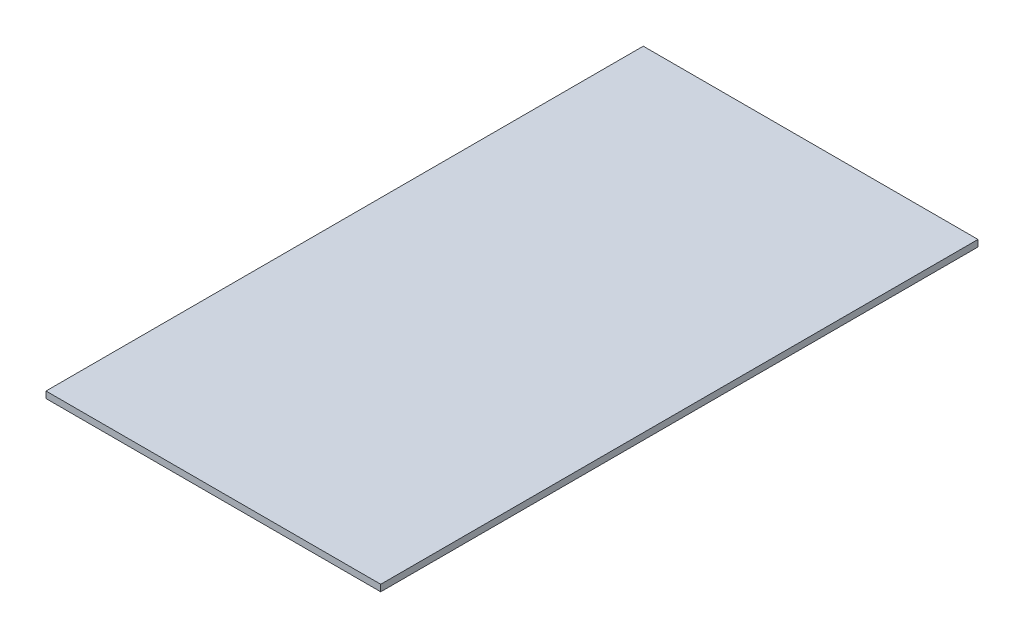
ISO-10303-21;
HEADER;
FILE_DESCRIPTION(('STEP AP214'),'2;1');
FILE_NAME('part.step','',(''),(''),'','','');
FILE_SCHEMA(('AUTOMOTIVE_DESIGN { 1 0 10303 214 1 1 1 1 }'));
ENDSEC;
DATA;
#1=APPLICATION_CONTEXT('core data for automotive mechanical design processes');
#2=APPLICATION_PROTOCOL_DEFINITION('international standard','automotive_design',2000,#1);
#3=PRODUCT_CONTEXT('',#1,'mechanical');
#4=PRODUCT('Part','Part','',(#3));
#5=PRODUCT_RELATED_PRODUCT_CATEGORY('part','',(#4));
#6=PRODUCT_DEFINITION_FORMATION('','',#4);
#7=PRODUCT_DEFINITION_CONTEXT('part definition',#1,'design');
#8=PRODUCT_DEFINITION('design','',#6,#7);
#9=PRODUCT_DEFINITION_SHAPE('','',#8);
#10=(LENGTH_UNIT() NAMED_UNIT(*) SI_UNIT(.MILLI.,.METRE.));
#11=(NAMED_UNIT(*) PLANE_ANGLE_UNIT() SI_UNIT($,.RADIAN.));
#12=(NAMED_UNIT(*) SI_UNIT($,.STERADIAN.) SOLID_ANGLE_UNIT());
#13=UNCERTAINTY_MEASURE_WITH_UNIT(LENGTH_MEASURE(1.E-05),#10,'distance_accuracy_value','');
#14=(GEOMETRIC_REPRESENTATION_CONTEXT(3) GLOBAL_UNCERTAINTY_ASSIGNED_CONTEXT((#13)) GLOBAL_UNIT_ASSIGNED_CONTEXT((#10,
#11,#12)) REPRESENTATION_CONTEXT('',''));
#15=CARTESIAN_POINT('',(0.,0.,0.));
#16=DIRECTION('',(0.,0.,1.));
#17=DIRECTION('',(1.,0.,0.));
#18=AXIS2_PLACEMENT_3D('',#15,#16,#17);
#19=CARTESIAN_POINT('',(16.2940289369417,415.676617250913,-305.800739351403));
#20=DIRECTION('',(-1.,0.,0.));
#21=DIRECTION('',(0.,0.,1.));
#22=AXIS2_PLACEMENT_3D('',#19,#20,#21);
#23=PLANE('',#22);
#24=DIRECTION('',(0.,0.,1.));
#25=VECTOR('',#24,1.);
#26=CARTESIAN_POINT('',(16.2940289369417,420.676617250913,-305.800739351403));
#27=LINE('',#26,#25);
#28=CARTESIAN_POINT('',(16.2940289369418,420.676617250913,-283.300739351403));
#29=VERTEX_POINT('',#28);
#30=CARTESIAN_POINT('',(16.2940289369424,420.676617250913,171.699260648597));
#31=VERTEX_POINT('',#30);
#32=EDGE_CURVE('E96',#29,#31,#27,.T.);
#33=ORIENTED_EDGE('',*,*,#32,.F.);
#34=DIRECTION('',(0.,1.,0.));
#35=VECTOR('',#34,1.);
#36=CARTESIAN_POINT('',(16.2940289369418,415.676617250913,-283.300739351403));
#37=LINE('',#36,#35);
#38=CARTESIAN_POINT('',(16.2940289369418,415.676617250913,-283.300739351403));
#39=VERTEX_POINT('',#38);
#40=EDGE_CURVE('E11',#39,#29,#37,.T.);
#41=ORIENTED_EDGE('',*,*,#40,.F.);
#42=DIRECTION('',(0.,0.,1.));
#43=VECTOR('',#42,1.);
#44=CARTESIAN_POINT('',(16.2940289369417,415.676617250913,-305.800739351403));
#45=LINE('',#44,#43);
#46=CARTESIAN_POINT('',(16.2940289369424,415.676617250913,171.699260648597));
#47=VERTEX_POINT('',#46);
#48=EDGE_CURVE('E90',#39,#47,#45,.T.);
#49=ORIENTED_EDGE('',*,*,#48,.T.);
#50=DIRECTION('',(0.,1.,0.));
#51=VECTOR('',#50,1.);
#52=CARTESIAN_POINT('',(16.2940289369424,415.676617250913,171.699260648597));
#53=LINE('',#52,#51);
#54=EDGE_CURVE('E35',#47,#31,#53,.T.);
#55=ORIENTED_EDGE('',*,*,#54,.T.);
#56=EDGE_LOOP('',(#33,#41,#49,#55));
#57=FACE_BOUND('',#56,.T.);
#58=ADVANCED_FACE('F32',(#57),#23,.T.);
#59=CARTESIAN_POINT('',(-3.00597106305825,415.676617250913,-283.300739351403));
#60=DIRECTION('',(0.,0.,-1.));
#61=DIRECTION('',(-1.,0.,0.));
#62=AXIS2_PLACEMENT_3D('',#59,#60,#61);
#63=PLANE('',#62);
#64=DIRECTION('',(-1.,0.,0.));
#65=VECTOR('',#64,1.);
#66=CARTESIAN_POINT('',(-3.00597106305825,420.676617250913,-283.300739351403));
#67=LINE('',#66,#65);
#68=CARTESIAN_POINT('',(271.294028936942,420.676617250913,-283.300739351403));
#69=VERTEX_POINT('',#68);
#70=EDGE_CURVE('E92',#69,#29,#67,.T.);
#71=ORIENTED_EDGE('',*,*,#70,.F.);
#72=DIRECTION('',(0.,1.,0.));
#73=VECTOR('',#72,1.);
#74=CARTESIAN_POINT('',(271.294028936942,415.676617250913,-283.300739351403));
#75=LINE('',#74,#73);
#76=CARTESIAN_POINT('',(271.294028936942,415.676617250913,-283.300739351403));
#77=VERTEX_POINT('',#76);
#78=EDGE_CURVE('E41',#77,#69,#75,.T.);
#79=ORIENTED_EDGE('',*,*,#78,.F.);
#80=DIRECTION('',(-1.,0.,0.));
#81=VECTOR('',#80,1.);
#82=CARTESIAN_POINT('',(-3.00597106305825,415.676617250913,-283.300739351403));
#83=LINE('',#82,#81);
#84=EDGE_CURVE('E87',#77,#39,#83,.T.);
#85=ORIENTED_EDGE('',*,*,#84,.T.);
#86=ORIENTED_EDGE('',*,*,#40,.T.);
#87=EDGE_LOOP('',(#71,#79,#85,#86));
#88=FACE_BOUND('',#87,.T.);
#89=ADVANCED_FACE('F106',(#88),#63,.T.);
#90=CARTESIAN_POINT('',(271.294028936942,415.676617250913,-305.800739351403));
#91=DIRECTION('',(1.,0.,0.));
#92=DIRECTION('',(0.,0.,-1.));
#93=AXIS2_PLACEMENT_3D('',#90,#91,#92);
#94=PLANE('',#93);
#95=DIRECTION('',(0.,0.,-1.));
#96=VECTOR('',#95,1.);
#97=CARTESIAN_POINT('',(271.294028936942,420.676617250913,-305.800739351403));
#98=LINE('',#97,#96);
#99=CARTESIAN_POINT('',(271.294028936942,420.676617250913,171.699260648597));
#100=VERTEX_POINT('',#99);
#101=EDGE_CURVE('E82',#100,#69,#98,.T.);
#102=ORIENTED_EDGE('',*,*,#101,.F.);
#103=DIRECTION('',(0.,1.,0.));
#104=VECTOR('',#103,1.);
#105=CARTESIAN_POINT('',(271.294028936942,415.676617250913,171.699260648597));
#106=LINE('',#105,#104);
#107=CARTESIAN_POINT('',(271.294028936942,415.676617250913,171.699260648597));
#108=VERTEX_POINT('',#107);
#109=EDGE_CURVE('E77',#108,#100,#106,.T.);
#110=ORIENTED_EDGE('',*,*,#109,.F.);
#111=DIRECTION('',(0.,0.,-1.));
#112=VECTOR('',#111,1.);
#113=CARTESIAN_POINT('',(271.294028936942,415.676617250913,-305.800739351403));
#114=LINE('',#113,#112);
#115=EDGE_CURVE('E80',#108,#77,#114,.T.);
#116=ORIENTED_EDGE('',*,*,#115,.T.);
#117=ORIENTED_EDGE('',*,*,#78,.T.);
#118=EDGE_LOOP('',(#102,#110,#116,#117));
#119=FACE_BOUND('',#118,.T.);
#120=ADVANCED_FACE('F79',(#119),#94,.T.);
#121=CARTESIAN_POINT('',(-3.00597106305835,415.676617250913,171.699260648597));
#122=DIRECTION('',(0.,0.,1.));
#123=DIRECTION('',(1.,0.,0.));
#124=AXIS2_PLACEMENT_3D('',#121,#122,#123);
#125=PLANE('',#124);
#126=DIRECTION('',(1.,0.,0.));
#127=VECTOR('',#126,1.);
#128=CARTESIAN_POINT('',(-3.00597106305835,420.676617250913,171.699260648597));
#129=LINE('',#128,#127);
#130=EDGE_CURVE('E99',#31,#100,#129,.T.);
#131=ORIENTED_EDGE('',*,*,#130,.F.);
#132=ORIENTED_EDGE('',*,*,#54,.F.);
#133=DIRECTION('',(1.,0.,0.));
#134=VECTOR('',#133,1.);
#135=CARTESIAN_POINT('',(-3.00597106305835,415.676617250913,171.699260648597));
#136=LINE('',#135,#134);
#137=EDGE_CURVE('E86',#47,#108,#136,.T.);
#138=ORIENTED_EDGE('',*,*,#137,.T.);
#139=ORIENTED_EDGE('',*,*,#109,.T.);
#140=EDGE_LOOP('',(#131,#132,#138,#139));
#141=FACE_BOUND('',#140,.T.);
#142=ADVANCED_FACE('F89',(#141),#125,.T.);
#143=CARTESIAN_POINT('',(0.,415.676617250913,0.));
#144=DIRECTION('',(0.,1.,0.));
#145=DIRECTION('',(0.,0.,1.));
#146=AXIS2_PLACEMENT_3D('',#143,#144,#145);
#147=PLANE('',#146);
#148=ORIENTED_EDGE('',*,*,#48,.F.);
#149=ORIENTED_EDGE('',*,*,#84,.F.);
#150=ORIENTED_EDGE('',*,*,#115,.F.);
#151=ORIENTED_EDGE('',*,*,#137,.F.);
#152=EDGE_LOOP('',(#148,#149,#150,#151));
#153=FACE_BOUND('',#152,.T.);
#154=ADVANCED_FACE('F85',(#153),#147,.F.);
#155=CARTESIAN_POINT('',(0.,420.676617250913,0.));
#156=DIRECTION('',(0.,1.,0.));
#157=DIRECTION('',(0.,0.,1.));
#158=AXIS2_PLACEMENT_3D('',#155,#156,#157);
#159=PLANE('',#158);
#160=ORIENTED_EDGE('',*,*,#32,.T.);
#161=ORIENTED_EDGE('',*,*,#130,.T.);
#162=ORIENTED_EDGE('',*,*,#101,.T.);
#163=ORIENTED_EDGE('',*,*,#70,.T.);
#164=EDGE_LOOP('',(#160,#161,#162,#163));
#165=FACE_BOUND('',#164,.T.);
#166=ADVANCED_FACE('F105',(#165),#159,.T.);
#167=CLOSED_SHELL('',(#58,#89,#120,#142,#154,#166));
#168=MANIFOLD_SOLID_BREP('B2',#167);
#169=ADVANCED_BREP_SHAPE_REPRESENTATION('',(#18,#168),#14);
#170=SHAPE_DEFINITION_REPRESENTATION(#9,#169);
ENDSEC;
END-ISO-10303-21;
